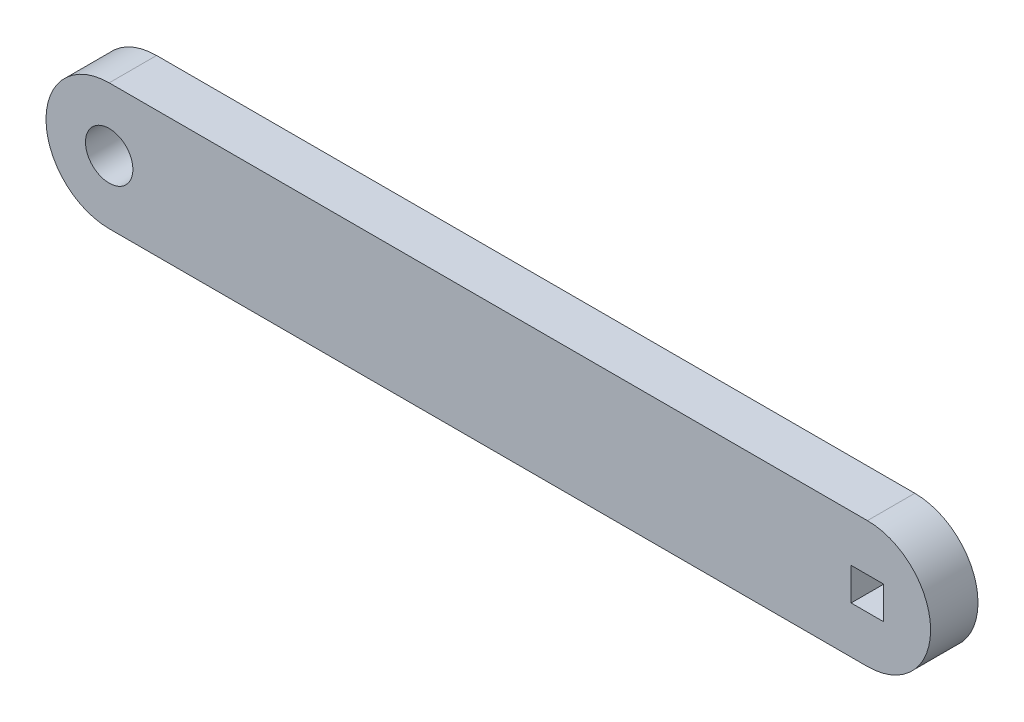
ISO-10303-21;
HEADER;
FILE_DESCRIPTION(('STEP AP214'),'2;1');
FILE_NAME('part.step','',(''),(''),'','','');
FILE_SCHEMA(('AUTOMOTIVE_DESIGN { 1 0 10303 214 1 1 1 1 }'));
ENDSEC;
DATA;
#1=APPLICATION_CONTEXT('core data for automotive mechanical design processes');
#2=APPLICATION_PROTOCOL_DEFINITION('international standard','automotive_design',2000,#1);
#3=PRODUCT_CONTEXT('',#1,'mechanical');
#4=PRODUCT('Part','Part','',(#3));
#5=PRODUCT_RELATED_PRODUCT_CATEGORY('part','',(#4));
#6=PRODUCT_DEFINITION_FORMATION('','',#4);
#7=PRODUCT_DEFINITION_CONTEXT('part definition',#1,'design');
#8=PRODUCT_DEFINITION('design','',#6,#7);
#9=PRODUCT_DEFINITION_SHAPE('','',#8);
#10=(LENGTH_UNIT() NAMED_UNIT(*) SI_UNIT(.MILLI.,.METRE.));
#11=(NAMED_UNIT(*) PLANE_ANGLE_UNIT() SI_UNIT($,.RADIAN.));
#12=(NAMED_UNIT(*) SI_UNIT($,.STERADIAN.) SOLID_ANGLE_UNIT());
#13=UNCERTAINTY_MEASURE_WITH_UNIT(LENGTH_MEASURE(1.E-05),#10,'distance_accuracy_value','');
#14=(GEOMETRIC_REPRESENTATION_CONTEXT(3) GLOBAL_UNCERTAINTY_ASSIGNED_CONTEXT((#13)) GLOBAL_UNIT_ASSIGNED_CONTEXT((#10,
#11,#12)) REPRESENTATION_CONTEXT('',''));
#15=CARTESIAN_POINT('',(0.,0.,0.));
#16=DIRECTION('',(0.,0.,1.));
#17=DIRECTION('',(1.,0.,0.));
#18=AXIS2_PLACEMENT_3D('',#15,#16,#17);
#19=CARTESIAN_POINT('',(0.,0.,4.7625));
#20=DIRECTION('',(0.,0.,1.));
#21=DIRECTION('',(1.,0.,0.));
#22=AXIS2_PLACEMENT_3D('',#19,#20,#21);
#23=PLANE('',#22);
#24=CARTESIAN_POINT('',(0.,0.,4.7625));
#25=DIRECTION('',(0.,0.,1.));
#26=DIRECTION('',(1.,0.,0.));
#27=AXIS2_PLACEMENT_3D('',#24,#25,#26);
#28=CIRCLE('',#27,6.35);
#29=CARTESIAN_POINT('',(0.,6.35,4.7625));
#30=VERTEX_POINT('',#29);
#31=CARTESIAN_POINT('',(0.,-6.35,4.7625));
#32=VERTEX_POINT('',#31);
#33=EDGE_CURVE('E140',#30,#32,#28,.T.);
#34=ORIENTED_EDGE('',*,*,#33,.T.);
#35=DIRECTION('',(1.,0.,0.));
#36=VECTOR('',#35,1.);
#37=CARTESIAN_POINT('',(0.,-6.35,4.7625));
#38=LINE('',#37,#36);
#39=CARTESIAN_POINT('',(76.2,-6.35,4.7625));
#40=VERTEX_POINT('',#39);
#41=EDGE_CURVE('E143',#32,#40,#38,.T.);
#42=ORIENTED_EDGE('',*,*,#41,.T.);
#43=CARTESIAN_POINT('',(76.2,0.,4.7625));
#44=DIRECTION('',(0.,0.,1.));
#45=DIRECTION('',(1.,0.,0.));
#46=AXIS2_PLACEMENT_3D('',#43,#44,#45);
#47=CIRCLE('',#46,6.35);
#48=CARTESIAN_POINT('',(76.2,6.35,4.7625));
#49=VERTEX_POINT('',#48);
#50=EDGE_CURVE('E146',#40,#49,#47,.T.);
#51=ORIENTED_EDGE('',*,*,#50,.T.);
#52=DIRECTION('',(-1.,0.,0.));
#53=VECTOR('',#52,1.);
#54=CARTESIAN_POINT('',(0.,6.35,4.7625));
#55=LINE('',#54,#53);
#56=EDGE_CURVE('E148',#49,#30,#55,.T.);
#57=ORIENTED_EDGE('',*,*,#56,.T.);
#58=EDGE_LOOP('',(#34,#42,#51,#57));
#59=FACE_BOUND('',#58,.T.);
#60=CARTESIAN_POINT('',(0.,0.,4.7625));
#61=DIRECTION('',(0.,0.,1.));
#62=DIRECTION('',(1.,0.,0.));
#63=AXIS2_PLACEMENT_3D('',#60,#61,#62);
#64=CIRCLE('',#63,2.38125);
#65=CARTESIAN_POINT('',(-2.38125,0.,4.7625));
#66=VERTEX_POINT('',#65);
#67=EDGE_CURVE('E134',#66,#66,#64,.T.);
#68=ORIENTED_EDGE('',*,*,#67,.F.);
#69=EDGE_LOOP('',(#68));
#70=FACE_BOUND('',#69,.T.);
#71=DIRECTION('',(1.,0.,0.));
#72=VECTOR('',#71,1.);
#73=CARTESIAN_POINT('',(77.8383,-1.6383,4.7625));
#74=LINE('',#73,#72);
#75=CARTESIAN_POINT('',(74.5617,-1.6383,4.7625));
#76=VERTEX_POINT('',#75);
#77=CARTESIAN_POINT('',(77.8383,-1.6383,4.7625));
#78=VERTEX_POINT('',#77);
#79=EDGE_CURVE('E106',#76,#78,#74,.T.);
#80=ORIENTED_EDGE('',*,*,#79,.F.);
#81=DIRECTION('',(0.,-1.,0.));
#82=VECTOR('',#81,1.);
#83=CARTESIAN_POINT('',(74.5617,-1.6383,4.7625));
#84=LINE('',#83,#82);
#85=CARTESIAN_POINT('',(74.5617,1.63830000000001,4.7625));
#86=VERTEX_POINT('',#85);
#87=EDGE_CURVE('E98',#86,#76,#84,.T.);
#88=ORIENTED_EDGE('',*,*,#87,.F.);
#89=DIRECTION('',(-1.,0.,0.));
#90=VECTOR('',#89,1.);
#91=CARTESIAN_POINT('',(77.8383,1.63830000000001,4.7625));
#92=LINE('',#91,#90);
#93=CARTESIAN_POINT('',(77.8383,1.63830000000001,4.7625));
#94=VERTEX_POINT('',#93);
#95=EDGE_CURVE('E120',#94,#86,#92,.T.);
#96=ORIENTED_EDGE('',*,*,#95,.F.);
#97=DIRECTION('',(0.,1.,0.));
#98=VECTOR('',#97,1.);
#99=CARTESIAN_POINT('',(77.8383,-1.6383,4.7625));
#100=LINE('',#99,#98);
#101=EDGE_CURVE('E118',#78,#94,#100,.T.);
#102=ORIENTED_EDGE('',*,*,#101,.F.);
#103=EDGE_LOOP('',(#80,#88,#96,#102));
#104=FACE_BOUND('',#103,.T.);
#105=ADVANCED_FACE('F33',(#59,#70,#104),#23,.T.);
#106=CARTESIAN_POINT('',(0.,0.,0.));
#107=DIRECTION('',(0.,0.,1.));
#108=DIRECTION('',(1.,0.,0.));
#109=AXIS2_PLACEMENT_3D('',#106,#107,#108);
#110=PLANE('',#109);
#111=CARTESIAN_POINT('',(0.,0.,0.));
#112=DIRECTION('',(0.,0.,1.));
#113=DIRECTION('',(1.,0.,0.));
#114=AXIS2_PLACEMENT_3D('',#111,#112,#113);
#115=CIRCLE('',#114,2.38125);
#116=CARTESIAN_POINT('',(-2.38125,0.,0.));
#117=VERTEX_POINT('',#116);
#118=EDGE_CURVE('E114',#117,#117,#115,.T.);
#119=ORIENTED_EDGE('',*,*,#118,.T.);
#120=EDGE_LOOP('',(#119));
#121=FACE_BOUND('',#120,.T.);
#122=CARTESIAN_POINT('',(0.,0.,0.));
#123=DIRECTION('',(0.,0.,1.));
#124=DIRECTION('',(1.,0.,0.));
#125=AXIS2_PLACEMENT_3D('',#122,#123,#124);
#126=CIRCLE('',#125,6.35);
#127=CARTESIAN_POINT('',(0.,6.35,0.));
#128=VERTEX_POINT('',#127);
#129=CARTESIAN_POINT('',(0.,-6.35,0.));
#130=VERTEX_POINT('',#129);
#131=EDGE_CURVE('E137',#128,#130,#126,.T.);
#132=ORIENTED_EDGE('',*,*,#131,.F.);
#133=DIRECTION('',(-1.,0.,0.));
#134=VECTOR('',#133,1.);
#135=CARTESIAN_POINT('',(0.,6.35,0.));
#136=LINE('',#135,#134);
#137=CARTESIAN_POINT('',(76.2,6.35,0.));
#138=VERTEX_POINT('',#137);
#139=EDGE_CURVE('E144',#138,#128,#136,.T.);
#140=ORIENTED_EDGE('',*,*,#139,.F.);
#141=CARTESIAN_POINT('',(76.2,0.,0.));
#142=DIRECTION('',(0.,0.,1.));
#143=DIRECTION('',(1.,0.,0.));
#144=AXIS2_PLACEMENT_3D('',#141,#142,#143);
#145=CIRCLE('',#144,6.35);
#146=CARTESIAN_POINT('',(76.2,-6.35,0.));
#147=VERTEX_POINT('',#146);
#148=EDGE_CURVE('E155',#147,#138,#145,.T.);
#149=ORIENTED_EDGE('',*,*,#148,.F.);
#150=DIRECTION('',(1.,0.,0.));
#151=VECTOR('',#150,1.);
#152=CARTESIAN_POINT('',(0.,-6.35,0.));
#153=LINE('',#152,#151);
#154=EDGE_CURVE('E153',#130,#147,#153,.T.);
#155=ORIENTED_EDGE('',*,*,#154,.F.);
#156=EDGE_LOOP('',(#132,#140,#149,#155));
#157=FACE_BOUND('',#156,.T.);
#158=DIRECTION('',(0.,-1.,0.));
#159=VECTOR('',#158,1.);
#160=CARTESIAN_POINT('',(74.5617,-1.6383,0.));
#161=LINE('',#160,#159);
#162=CARTESIAN_POINT('',(74.5617,1.63830000000001,0.));
#163=VERTEX_POINT('',#162);
#164=CARTESIAN_POINT('',(74.5617,-1.6383,0.));
#165=VERTEX_POINT('',#164);
#166=EDGE_CURVE('E56',#163,#165,#161,.T.);
#167=ORIENTED_EDGE('',*,*,#166,.T.);
#168=DIRECTION('',(1.,0.,0.));
#169=VECTOR('',#168,1.);
#170=CARTESIAN_POINT('',(77.8383,-1.6383,0.));
#171=LINE('',#170,#169);
#172=CARTESIAN_POINT('',(77.8383,-1.6383,0.));
#173=VERTEX_POINT('',#172);
#174=EDGE_CURVE('E113',#165,#173,#171,.T.);
#175=ORIENTED_EDGE('',*,*,#174,.T.);
#176=DIRECTION('',(0.,1.,0.));
#177=VECTOR('',#176,1.);
#178=CARTESIAN_POINT('',(77.8383,-1.6383,0.));
#179=LINE('',#178,#177);
#180=CARTESIAN_POINT('',(77.8383,1.63830000000001,0.));
#181=VERTEX_POINT('',#180);
#182=EDGE_CURVE('E126',#173,#181,#179,.T.);
#183=ORIENTED_EDGE('',*,*,#182,.T.);
#184=DIRECTION('',(-1.,0.,0.));
#185=VECTOR('',#184,1.);
#186=CARTESIAN_POINT('',(77.8383,1.63830000000001,0.));
#187=LINE('',#186,#185);
#188=EDGE_CURVE('E107',#181,#163,#187,.T.);
#189=ORIENTED_EDGE('',*,*,#188,.T.);
#190=EDGE_LOOP('',(#167,#175,#183,#189));
#191=FACE_BOUND('',#190,.T.);
#192=ADVANCED_FACE('F173',(#121,#157,#191),#110,.F.);
#193=CARTESIAN_POINT('',(0.,0.,4.7625));
#194=DIRECTION('',(0.,0.,-1.));
#195=DIRECTION('',(-1.,0.,0.));
#196=AXIS2_PLACEMENT_3D('',#193,#194,#195);
#197=CYLINDRICAL_SURFACE('',#196,6.35);
#198=ORIENTED_EDGE('',*,*,#131,.T.);
#199=DIRECTION('',(0.,0.,-1.));
#200=VECTOR('',#199,1.);
#201=CARTESIAN_POINT('',(0.,-6.35,4.7625));
#202=LINE('',#201,#200);
#203=EDGE_CURVE('E11',#32,#130,#202,.T.);
#204=ORIENTED_EDGE('',*,*,#203,.F.);
#205=ORIENTED_EDGE('',*,*,#33,.F.);
#206=DIRECTION('',(0.,0.,-1.));
#207=VECTOR('',#206,1.);
#208=CARTESIAN_POINT('',(0.,6.35,4.7625));
#209=LINE('',#208,#207);
#210=EDGE_CURVE('E150',#30,#128,#209,.T.);
#211=ORIENTED_EDGE('',*,*,#210,.T.);
#212=EDGE_LOOP('',(#198,#204,#205,#211));
#213=FACE_BOUND('',#212,.T.);
#214=ADVANCED_FACE('F35',(#213),#197,.T.);
#215=CARTESIAN_POINT('',(0.,-6.35,4.7625));
#216=DIRECTION('',(0.,1.,0.));
#217=DIRECTION('',(0.,0.,1.));
#218=AXIS2_PLACEMENT_3D('',#215,#216,#217);
#219=PLANE('',#218);
#220=ORIENTED_EDGE('',*,*,#154,.T.);
#221=DIRECTION('',(0.,0.,-1.));
#222=VECTOR('',#221,1.);
#223=CARTESIAN_POINT('',(76.2,-6.35,4.7625));
#224=LINE('',#223,#222);
#225=EDGE_CURVE('E41',#40,#147,#224,.T.);
#226=ORIENTED_EDGE('',*,*,#225,.F.);
#227=ORIENTED_EDGE('',*,*,#41,.F.);
#228=ORIENTED_EDGE('',*,*,#203,.T.);
#229=EDGE_LOOP('',(#220,#226,#227,#228));
#230=FACE_BOUND('',#229,.T.);
#231=ADVANCED_FACE('F184',(#230),#219,.F.);
#232=CARTESIAN_POINT('',(76.2,0.,4.7625));
#233=DIRECTION('',(0.,0.,-1.));
#234=DIRECTION('',(-1.,0.,0.));
#235=AXIS2_PLACEMENT_3D('',#232,#233,#234);
#236=CYLINDRICAL_SURFACE('',#235,6.35);
#237=ORIENTED_EDGE('',*,*,#148,.T.);
#238=DIRECTION('',(0.,0.,-1.));
#239=VECTOR('',#238,1.);
#240=CARTESIAN_POINT('',(76.2,6.35,4.7625));
#241=LINE('',#240,#239);
#242=EDGE_CURVE('E160',#49,#138,#241,.T.);
#243=ORIENTED_EDGE('',*,*,#242,.F.);
#244=ORIENTED_EDGE('',*,*,#50,.F.);
#245=ORIENTED_EDGE('',*,*,#225,.T.);
#246=EDGE_LOOP('',(#237,#243,#244,#245));
#247=FACE_BOUND('',#246,.T.);
#248=ADVANCED_FACE('F167',(#247),#236,.T.);
#249=CARTESIAN_POINT('',(0.,6.35,4.7625));
#250=DIRECTION('',(0.,-1.,0.));
#251=DIRECTION('',(0.,0.,-1.));
#252=AXIS2_PLACEMENT_3D('',#249,#250,#251);
#253=PLANE('',#252);
#254=ORIENTED_EDGE('',*,*,#139,.T.);
#255=ORIENTED_EDGE('',*,*,#210,.F.);
#256=ORIENTED_EDGE('',*,*,#56,.F.);
#257=ORIENTED_EDGE('',*,*,#242,.T.);
#258=EDGE_LOOP('',(#254,#255,#256,#257));
#259=FACE_BOUND('',#258,.T.);
#260=ADVANCED_FACE('F177',(#259),#253,.F.);
#261=CARTESIAN_POINT('',(0.,0.,4.7625));
#262=DIRECTION('',(0.,0.,-1.));
#263=DIRECTION('',(-1.,0.,0.));
#264=AXIS2_PLACEMENT_3D('',#261,#262,#263);
#265=CYLINDRICAL_SURFACE('',#264,2.38125);
#266=CARTESIAN_POINT('',(-2.38125,0.,4.7625));
#267=CARTESIAN_POINT('',(-2.38125,0.,4.712890625));
#268=CARTESIAN_POINT('',(-2.38125,0.,4.66328125));
#269=CARTESIAN_POINT('',(-2.38125,0.,4.5640625));
#270=CARTESIAN_POINT('',(-2.38125,0.,4.514453125));
#271=CARTESIAN_POINT('',(-2.38125,0.,4.415234375));
#272=CARTESIAN_POINT('',(-2.38125,0.,4.365625));
#273=CARTESIAN_POINT('',(-2.38125,0.,4.26640625));
#274=CARTESIAN_POINT('',(-2.38125,0.,4.216796875));
#275=CARTESIAN_POINT('',(-2.38125,0.,4.117578125));
#276=CARTESIAN_POINT('',(-2.38125,0.,4.06796875));
#277=CARTESIAN_POINT('',(-2.38125,0.,3.96875));
#278=CARTESIAN_POINT('',(-2.38125,0.,3.919140625));
#279=CARTESIAN_POINT('',(-2.38125,0.,3.819921875));
#280=CARTESIAN_POINT('',(-2.38125,0.,3.7703125));
#281=CARTESIAN_POINT('',(-2.38125,0.,3.67109375));
#282=CARTESIAN_POINT('',(-2.38125,0.,3.621484375));
#283=CARTESIAN_POINT('',(-2.38125,0.,3.522265625));
#284=CARTESIAN_POINT('',(-2.38125,0.,3.47265625));
#285=CARTESIAN_POINT('',(-2.38125,0.,3.3734375));
#286=CARTESIAN_POINT('',(-2.38125,0.,3.323828125));
#287=CARTESIAN_POINT('',(-2.38125,0.,3.224609375));
#288=CARTESIAN_POINT('',(-2.38125,0.,3.175));
#289=CARTESIAN_POINT('',(-2.38125,0.,3.07578125));
#290=CARTESIAN_POINT('',(-2.38125,0.,3.026171875));
#291=CARTESIAN_POINT('',(-2.38125,0.,2.926953125));
#292=CARTESIAN_POINT('',(-2.38125,0.,2.87734375));
#293=CARTESIAN_POINT('',(-2.38125,0.,2.778125));
#294=CARTESIAN_POINT('',(-2.38125,0.,2.728515625));
#295=CARTESIAN_POINT('',(-2.38125,0.,2.629296875));
#296=CARTESIAN_POINT('',(-2.38125,0.,2.5796875));
#297=CARTESIAN_POINT('',(-2.38125,0.,2.48046875));
#298=CARTESIAN_POINT('',(-2.38125,0.,2.430859375));
#299=CARTESIAN_POINT('',(-2.38125,0.,2.331640625));
#300=CARTESIAN_POINT('',(-2.38125,0.,2.28203125));
#301=CARTESIAN_POINT('',(-2.38125,0.,2.1828125));
#302=CARTESIAN_POINT('',(-2.38125,0.,2.133203125));
#303=CARTESIAN_POINT('',(-2.38125,0.,2.033984375));
#304=CARTESIAN_POINT('',(-2.38125,0.,1.984375));
#305=CARTESIAN_POINT('',(-2.38125,0.,1.88515625));
#306=CARTESIAN_POINT('',(-2.38125,0.,1.835546875));
#307=CARTESIAN_POINT('',(-2.38125,0.,1.736328125));
#308=CARTESIAN_POINT('',(-2.38125,0.,1.68671875));
#309=CARTESIAN_POINT('',(-2.38125,0.,1.5875));
#310=CARTESIAN_POINT('',(-2.38125,0.,1.537890625));
#311=CARTESIAN_POINT('',(-2.38125,0.,1.438671875));
#312=CARTESIAN_POINT('',(-2.38125,0.,1.3890625));
#313=CARTESIAN_POINT('',(-2.38125,0.,1.28984375));
#314=CARTESIAN_POINT('',(-2.38125,0.,1.240234375));
#315=CARTESIAN_POINT('',(-2.38125,0.,1.141015625));
#316=CARTESIAN_POINT('',(-2.38125,0.,1.09140625));
#317=CARTESIAN_POINT('',(-2.38125,0.,0.992187499999999));
#318=CARTESIAN_POINT('',(-2.38125,0.,0.942578124999999));
#319=CARTESIAN_POINT('',(-2.38125,0.,0.843359375));
#320=CARTESIAN_POINT('',(-2.38125,0.,0.79375));
#321=CARTESIAN_POINT('',(-2.38125,0.,0.69453125));
#322=CARTESIAN_POINT('',(-2.38125,0.,0.644921875));
#323=CARTESIAN_POINT('',(-2.38125,0.,0.545703125));
#324=CARTESIAN_POINT('',(-2.38125,0.,0.49609375));
#325=CARTESIAN_POINT('',(-2.38125,0.,0.396875));
#326=CARTESIAN_POINT('',(-2.38125,0.,0.347265625));
#327=CARTESIAN_POINT('',(-2.38125,0.,0.248046875));
#328=CARTESIAN_POINT('',(-2.38125,0.,0.1984375));
#329=CARTESIAN_POINT('',(-2.38125,0.,0.09921875));
#330=CARTESIAN_POINT('',(-2.38125,0.,0.049609375));
#331=CARTESIAN_POINT('',(-2.38125,0.,0.));
#332=B_SPLINE_CURVE_WITH_KNOTS('',3,(#266,#267,#268,#269,#270,#271,#272,#273,#274,#275,#276,
#277,#278,#279,#280,#281,#282,#283,#284,#285,#286,#287,#288,#289,#290,#291,#292,#293,#294,#295,
#296,#297,#298,#299,#300,#301,#302,#303,#304,#305,#306,#307,#308,#309,#310,#311,#312,#313,#314,
#315,#316,#317,#318,#319,#320,#321,#322,#323,#324,#325,#326,#327,#328,#329,#330,#331),
.UNSPECIFIED.,.F.,.F.,(4,2,2,2,2,2,2,2,2,2,2,2,2,2,2,2,2,2,2,2,2,2,2,2,2,2,2,2,2,2,2,2,4),(0.,
0.148828125,0.29765625,0.446484375,0.5953125,0.744140625,0.892968750000001,1.041796875,1.190625,
1.339453125,1.48828125,1.637109375,1.7859375,1.934765625,2.08359375,2.232421875,2.38125,
2.530078125,2.67890625,2.827734375,2.9765625,3.125390625,3.27421875,3.423046875,3.571875,
3.720703125,3.86953125,4.018359375,4.1671875,4.316015625,4.46484375,4.613671875,4.7625),.UNSPECIFIED.);
#333=EDGE_CURVE('BSEAM199',#66,#117,#332,.T.);
#334=ORIENTED_EDGE('',*,*,#67,.T.);
#335=ORIENTED_EDGE('',*,*,#118,.F.);
#336=ORIENTED_EDGE('',*,*,#333,.T.);
#337=ORIENTED_EDGE('',*,*,#333,.F.);
#338=EDGE_LOOP('',(#334,#336,#335,#337));
#339=FACE_BOUND('',#338,.T.);
#340=ADVANCED_FACE('F199',(#339),#265,.F.);
#341=CARTESIAN_POINT('',(74.5617,-1.6383,4.7625));
#342=DIRECTION('',(1.,0.,0.));
#343=DIRECTION('',(0.,0.,-1.));
#344=AXIS2_PLACEMENT_3D('',#341,#342,#343);
#345=PLANE('',#344);
#346=ORIENTED_EDGE('',*,*,#166,.F.);
#347=DIRECTION('',(0.,0.,-1.));
#348=VECTOR('',#347,1.);
#349=CARTESIAN_POINT('',(74.5617,1.63830000000001,4.7625));
#350=LINE('',#349,#348);
#351=EDGE_CURVE('E102',#86,#163,#350,.T.);
#352=ORIENTED_EDGE('',*,*,#351,.F.);
#353=ORIENTED_EDGE('',*,*,#87,.T.);
#354=DIRECTION('',(0.,0.,-1.));
#355=VECTOR('',#354,1.);
#356=CARTESIAN_POINT('',(74.5617,-1.6383,4.7625));
#357=LINE('',#356,#355);
#358=EDGE_CURVE('E101',#76,#165,#357,.T.);
#359=ORIENTED_EDGE('',*,*,#358,.T.);
#360=EDGE_LOOP('',(#346,#352,#353,#359));
#361=FACE_BOUND('',#360,.T.);
#362=ADVANCED_FACE('F100',(#361),#345,.T.);
#363=CARTESIAN_POINT('',(77.8383,-1.6383,4.7625));
#364=DIRECTION('',(0.,1.,0.));
#365=DIRECTION('',(-1.,0.,0.));
#366=AXIS2_PLACEMENT_3D('',#363,#364,#365);
#367=PLANE('',#366);
#368=ORIENTED_EDGE('',*,*,#174,.F.);
#369=ORIENTED_EDGE('',*,*,#358,.F.);
#370=ORIENTED_EDGE('',*,*,#79,.T.);
#371=DIRECTION('',(0.,0.,-1.));
#372=VECTOR('',#371,1.);
#373=CARTESIAN_POINT('',(77.8383,-1.6383,4.7625));
#374=LINE('',#373,#372);
#375=EDGE_CURVE('E115',#78,#173,#374,.T.);
#376=ORIENTED_EDGE('',*,*,#375,.T.);
#377=EDGE_LOOP('',(#368,#369,#370,#376));
#378=FACE_BOUND('',#377,.T.);
#379=ADVANCED_FACE('F110',(#378),#367,.T.);
#380=CARTESIAN_POINT('',(77.8383,-1.6383,4.7625));
#381=DIRECTION('',(-1.,0.,0.));
#382=DIRECTION('',(0.,0.,1.));
#383=AXIS2_PLACEMENT_3D('',#380,#381,#382);
#384=PLANE('',#383);
#385=ORIENTED_EDGE('',*,*,#182,.F.);
#386=ORIENTED_EDGE('',*,*,#375,.F.);
#387=ORIENTED_EDGE('',*,*,#101,.T.);
#388=DIRECTION('',(0.,0.,-1.));
#389=VECTOR('',#388,1.);
#390=CARTESIAN_POINT('',(77.8383,1.63830000000001,4.7625));
#391=LINE('',#390,#389);
#392=EDGE_CURVE('E48',#94,#181,#391,.T.);
#393=ORIENTED_EDGE('',*,*,#392,.T.);
#394=EDGE_LOOP('',(#385,#386,#387,#393));
#395=FACE_BOUND('',#394,.T.);
#396=ADVANCED_FACE('F216',(#395),#384,.T.);
#397=CARTESIAN_POINT('',(77.8383,1.63830000000001,4.7625));
#398=DIRECTION('',(0.,-1.,0.));
#399=DIRECTION('',(1.,0.,0.));
#400=AXIS2_PLACEMENT_3D('',#397,#398,#399);
#401=PLANE('',#400);
#402=ORIENTED_EDGE('',*,*,#188,.F.);
#403=ORIENTED_EDGE('',*,*,#392,.F.);
#404=ORIENTED_EDGE('',*,*,#95,.T.);
#405=ORIENTED_EDGE('',*,*,#351,.T.);
#406=EDGE_LOOP('',(#402,#403,#404,#405));
#407=FACE_BOUND('',#406,.T.);
#408=ADVANCED_FACE('F221',(#407),#401,.T.);
#409=CLOSED_SHELL('',(#105,#192,#214,#231,#248,#260,#340,#362,#379,#396,#408));
#410=MANIFOLD_SOLID_BREP('B2',#409);
#411=ADVANCED_BREP_SHAPE_REPRESENTATION('',(#18,#410),#14);
#412=SHAPE_DEFINITION_REPRESENTATION(#9,#411);
ENDSEC;
END-ISO-10303-21;
